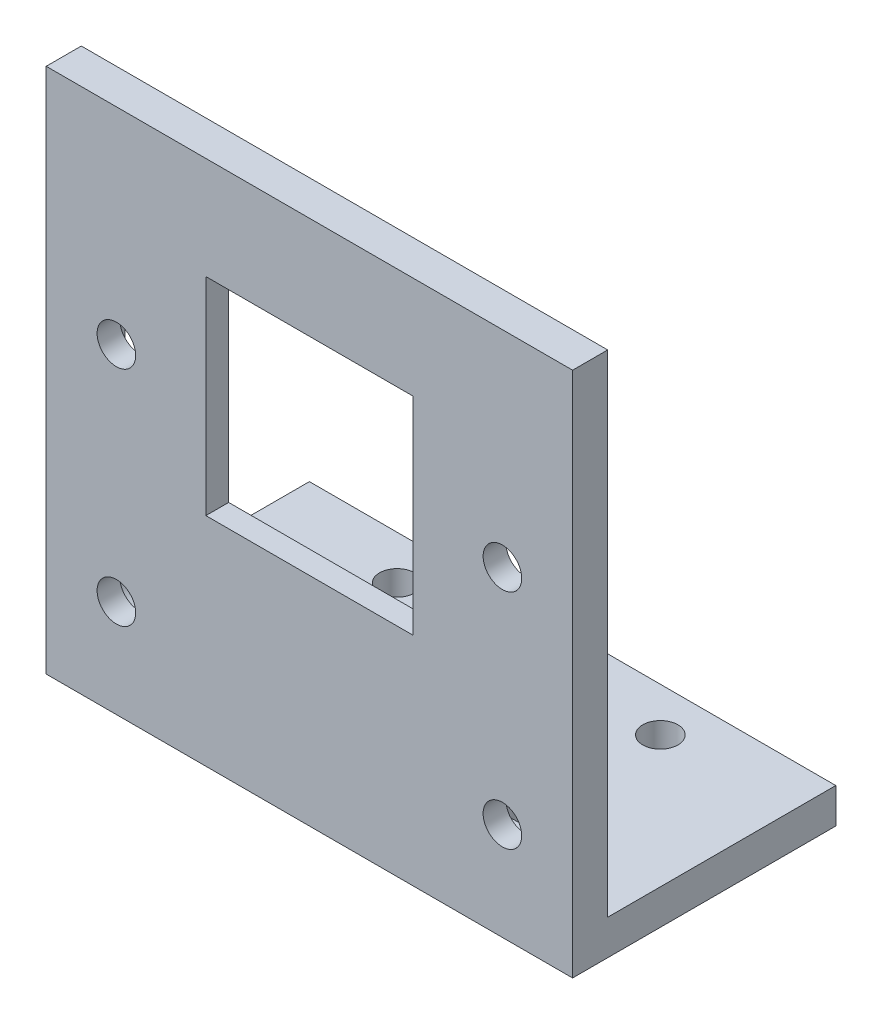
ISO-10303-21;
HEADER;
FILE_DESCRIPTION(('STEP AP214'),'2;1');
FILE_NAME('part.step','',(''),(''),'','','');
FILE_SCHEMA(('AUTOMOTIVE_DESIGN { 1 0 10303 214 1 1 1 1 }'));
ENDSEC;
DATA;
#1=APPLICATION_CONTEXT('core data for automotive mechanical design processes');
#2=APPLICATION_PROTOCOL_DEFINITION('international standard','automotive_design',2000,#1);
#3=PRODUCT_CONTEXT('',#1,'mechanical');
#4=PRODUCT('Part','Part','',(#3));
#5=PRODUCT_RELATED_PRODUCT_CATEGORY('part','',(#4));
#6=PRODUCT_DEFINITION_FORMATION('','',#4);
#7=PRODUCT_DEFINITION_CONTEXT('part definition',#1,'design');
#8=PRODUCT_DEFINITION('design','',#6,#7);
#9=PRODUCT_DEFINITION_SHAPE('','',#8);
#10=(LENGTH_UNIT() NAMED_UNIT(*) SI_UNIT(.MILLI.,.METRE.));
#11=(NAMED_UNIT(*) PLANE_ANGLE_UNIT() SI_UNIT($,.RADIAN.));
#12=(NAMED_UNIT(*) SI_UNIT($,.STERADIAN.) SOLID_ANGLE_UNIT());
#13=UNCERTAINTY_MEASURE_WITH_UNIT(LENGTH_MEASURE(1.E-05),#10,'distance_accuracy_value','');
#14=(GEOMETRIC_REPRESENTATION_CONTEXT(3) GLOBAL_UNCERTAINTY_ASSIGNED_CONTEXT((#13)) GLOBAL_UNIT_ASSIGNED_CONTEXT((#10,
#11,#12)) REPRESENTATION_CONTEXT('',''));
#15=CARTESIAN_POINT('',(0.,0.,0.));
#16=DIRECTION('',(0.,0.,1.));
#17=DIRECTION('',(1.,0.,0.));
#18=AXIS2_PLACEMENT_3D('',#15,#16,#17);
#19=CARTESIAN_POINT('',(11.,56.95,17.2));
#20=DIRECTION('',(0.,0.,-1.));
#21=DIRECTION('',(0.,1.,0.));
#22=AXIS2_PLACEMENT_3D('',#19,#20,#21);
#23=PLANE('',#22);
#24=CARTESIAN_POINT('',(-11.,48.7216,17.2));
#25=DIRECTION('',(0.,0.,-1.));
#26=DIRECTION('',(0.,1.,0.));
#27=AXIS2_PLACEMENT_3D('',#24,#25,#26);
#28=CIRCLE('',#27,1.09999999999999);
#29=CARTESIAN_POINT('',(-11.,49.8216,17.2));
#30=VERTEX_POINT('',#29);
#31=EDGE_CURVE('E606',#30,#30,#28,.F.);
#32=ORIENTED_EDGE('',*,*,#31,.T.);
#33=EDGE_LOOP('',(#32));
#34=FACE_BOUND('',#33,.T.);
#35=CARTESIAN_POINT('',(-11.,36.0216,17.2));
#36=DIRECTION('',(0.,0.,-1.));
#37=DIRECTION('',(0.,1.,0.));
#38=AXIS2_PLACEMENT_3D('',#35,#36,#37);
#39=CIRCLE('',#38,1.09999999999999);
#40=CARTESIAN_POINT('',(-11.,37.1216,17.2));
#41=VERTEX_POINT('',#40);
#42=EDGE_CURVE('E610',#41,#41,#39,.F.);
#43=ORIENTED_EDGE('',*,*,#42,.T.);
#44=EDGE_LOOP('',(#43));
#45=FACE_BOUND('',#44,.T.);
#46=CARTESIAN_POINT('',(11.,36.0216,17.2));
#47=DIRECTION('',(0.,0.,-1.));
#48=DIRECTION('',(0.,1.,0.));
#49=AXIS2_PLACEMENT_3D('',#46,#47,#48);
#50=CIRCLE('',#49,1.09999999999999);
#51=CARTESIAN_POINT('',(11.,37.1216,17.2));
#52=VERTEX_POINT('',#51);
#53=EDGE_CURVE('E631',#52,#52,#50,.F.);
#54=ORIENTED_EDGE('',*,*,#53,.T.);
#55=EDGE_LOOP('',(#54));
#56=FACE_BOUND('',#55,.T.);
#57=CARTESIAN_POINT('',(11.,48.7216,17.2));
#58=DIRECTION('',(0.,0.,-1.));
#59=DIRECTION('',(0.,1.,0.));
#60=AXIS2_PLACEMENT_3D('',#57,#58,#59);
#61=CIRCLE('',#60,1.09999999999999);
#62=CARTESIAN_POINT('',(11.,49.8216,17.2));
#63=VERTEX_POINT('',#62);
#64=EDGE_CURVE('E621',#63,#63,#61,.F.);
#65=ORIENTED_EDGE('',*,*,#64,.T.);
#66=EDGE_LOOP('',(#65));
#67=FACE_BOUND('',#66,.T.);
#68=CARTESIAN_POINT('',(11.,56.95,17.2));
#69=DIRECTION('',(0.,0.,-1.));
#70=DIRECTION('',(0.,1.,0.));
#71=AXIS2_PLACEMENT_3D('',#68,#69,#70);
#72=CIRCLE('',#71,1.5);
#73=CARTESIAN_POINT('',(11.,58.45,17.2));
#74=VERTEX_POINT('',#73);
#75=CARTESIAN_POINT('',(12.5,56.95,17.2));
#76=VERTEX_POINT('',#75);
#77=EDGE_CURVE('E193',#74,#76,#72,.T.);
#78=ORIENTED_EDGE('',*,*,#77,.T.);
#79=DIRECTION('',(0.,-1.,0.));
#80=VECTOR('',#79,1.);
#81=CARTESIAN_POINT('',(12.5,56.95,17.2));
#82=LINE('',#81,#80);
#83=CARTESIAN_POINT('',(12.5,36.09,17.2));
#84=VERTEX_POINT('',#83);
#85=EDGE_CURVE('E196',#76,#84,#82,.T.);
#86=ORIENTED_EDGE('',*,*,#85,.T.);
#87=CARTESIAN_POINT('',(11.,36.09,17.2));
#88=DIRECTION('',(0.,0.,-1.));
#89=DIRECTION('',(0.,1.,0.));
#90=AXIS2_PLACEMENT_3D('',#87,#88,#89);
#91=CIRCLE('',#90,1.5);
#92=CARTESIAN_POINT('',(11.,34.59,17.2));
#93=VERTEX_POINT('',#92);
#94=EDGE_CURVE('E199',#84,#93,#91,.T.);
#95=ORIENTED_EDGE('',*,*,#94,.T.);
#96=DIRECTION('',(-1.,0.,0.));
#97=VECTOR('',#96,1.);
#98=CARTESIAN_POINT('',(-11.,34.59,17.2));
#99=LINE('',#98,#97);
#100=CARTESIAN_POINT('',(-11.,34.59,17.2));
#101=VERTEX_POINT('',#100);
#102=EDGE_CURVE('E202',#93,#101,#99,.T.);
#103=ORIENTED_EDGE('',*,*,#102,.T.);
#104=CARTESIAN_POINT('',(-11.,36.09,17.2));
#105=DIRECTION('',(0.,0.,-1.));
#106=DIRECTION('',(0.,1.,0.));
#107=AXIS2_PLACEMENT_3D('',#104,#105,#106);
#108=CIRCLE('',#107,1.5);
#109=CARTESIAN_POINT('',(-12.5,36.09,17.2));
#110=VERTEX_POINT('',#109);
#111=EDGE_CURVE('E205',#101,#110,#108,.T.);
#112=ORIENTED_EDGE('',*,*,#111,.T.);
#113=DIRECTION('',(0.,1.,0.));
#114=VECTOR('',#113,1.);
#115=CARTESIAN_POINT('',(-12.5,36.09,17.2));
#116=LINE('',#115,#114);
#117=CARTESIAN_POINT('',(-12.5,56.95,17.2));
#118=VERTEX_POINT('',#117);
#119=EDGE_CURVE('E208',#110,#118,#116,.T.);
#120=ORIENTED_EDGE('',*,*,#119,.T.);
#121=CARTESIAN_POINT('',(-11.,56.95,17.2));
#122=DIRECTION('',(0.,0.,-1.));
#123=DIRECTION('',(0.,1.,0.));
#124=AXIS2_PLACEMENT_3D('',#121,#122,#123);
#125=CIRCLE('',#124,1.5);
#126=CARTESIAN_POINT('',(-11.,58.45,17.2));
#127=VERTEX_POINT('',#126);
#128=EDGE_CURVE('E210',#118,#127,#125,.T.);
#129=ORIENTED_EDGE('',*,*,#128,.T.);
#130=DIRECTION('',(1.,0.,0.));
#131=VECTOR('',#130,1.);
#132=CARTESIAN_POINT('',(-11.,58.45,17.2));
#133=LINE('',#132,#131);
#134=EDGE_CURVE('E213',#127,#74,#133,.T.);
#135=ORIENTED_EDGE('',*,*,#134,.T.);
#136=EDGE_LOOP('',(#78,#86,#95,#103,#112,#120,#129,#135));
#137=FACE_BOUND('',#136,.T.);
#138=DIRECTION('',(0.,1.,0.));
#139=VECTOR('',#138,1.);
#140=CARTESIAN_POINT('',(5.9,42.8216,17.2));
#141=LINE('',#140,#139);
#142=CARTESIAN_POINT('',(5.9,42.8216,17.2));
#143=VERTEX_POINT('',#142);
#144=CARTESIAN_POINT('',(5.9,54.6216,17.2));
#145=VERTEX_POINT('',#144);
#146=EDGE_CURVE('E175',#143,#145,#141,.T.);
#147=ORIENTED_EDGE('',*,*,#146,.T.);
#148=DIRECTION('',(-1.,0.,0.));
#149=VECTOR('',#148,1.);
#150=CARTESIAN_POINT('',(5.9,54.6216,17.2));
#151=LINE('',#150,#149);
#152=CARTESIAN_POINT('',(-5.90000000000001,54.6216,17.2));
#153=VERTEX_POINT('',#152);
#154=EDGE_CURVE('E170',#145,#153,#151,.T.);
#155=ORIENTED_EDGE('',*,*,#154,.T.);
#156=DIRECTION('',(0.,-1.,0.));
#157=VECTOR('',#156,1.);
#158=CARTESIAN_POINT('',(-5.90000000000001,54.6216,17.2));
#159=LINE('',#158,#157);
#160=CARTESIAN_POINT('',(-5.90000000000001,42.8216,17.2));
#161=VERTEX_POINT('',#160);
#162=EDGE_CURVE('E159',#153,#161,#159,.T.);
#163=ORIENTED_EDGE('',*,*,#162,.T.);
#164=DIRECTION('',(1.,0.,0.));
#165=VECTOR('',#164,1.);
#166=CARTESIAN_POINT('',(-5.90000000000001,42.8216,17.2));
#167=LINE('',#166,#165);
#168=EDGE_CURVE('E179',#161,#143,#167,.T.);
#169=ORIENTED_EDGE('',*,*,#168,.T.);
#170=EDGE_LOOP('',(#147,#155,#163,#169));
#171=FACE_BOUND('',#170,.T.);
#172=ADVANCED_FACE('F33',(#34,#45,#56,#67,#137,#171),#23,.T.);
#173=CARTESIAN_POINT('',(15.,32.45,3.5));
#174=DIRECTION('',(0.,0.,1.));
#175=DIRECTION('',(1.,0.,0.));
#176=AXIS2_PLACEMENT_3D('',#173,#174,#175);
#177=PLANE('',#176);
#178=DIRECTION('',(0.,1.,0.));
#179=VECTOR('',#178,1.);
#180=CARTESIAN_POINT('',(-15.,32.45,3.5));
#181=LINE('',#180,#179);
#182=CARTESIAN_POINT('',(-15.,30.45,3.5));
#183=VERTEX_POINT('',#182);
#184=CARTESIAN_POINT('',(-15.,32.45,3.5));
#185=VERTEX_POINT('',#184);
#186=EDGE_CURVE('E282',#183,#185,#181,.T.);
#187=ORIENTED_EDGE('',*,*,#186,.T.);
#188=DIRECTION('',(-1.,0.,0.));
#189=VECTOR('',#188,1.);
#190=CARTESIAN_POINT('',(15.,32.45,3.5));
#191=LINE('',#190,#189);
#192=CARTESIAN_POINT('',(15.,32.45,3.5));
#193=VERTEX_POINT('',#192);
#194=EDGE_CURVE('E11',#193,#185,#191,.T.);
#195=ORIENTED_EDGE('',*,*,#194,.F.);
#196=DIRECTION('',(0.,1.,0.));
#197=VECTOR('',#196,1.);
#198=CARTESIAN_POINT('',(15.,32.45,3.5));
#199=LINE('',#198,#197);
#200=CARTESIAN_POINT('',(15.,30.45,3.5));
#201=VERTEX_POINT('',#200);
#202=EDGE_CURVE('E267',#201,#193,#199,.T.);
#203=ORIENTED_EDGE('',*,*,#202,.F.);
#204=DIRECTION('',(-1.,0.,0.));
#205=VECTOR('',#204,1.);
#206=CARTESIAN_POINT('',(15.,30.45,3.5));
#207=LINE('',#206,#205);
#208=EDGE_CURVE('E281',#201,#183,#207,.T.);
#209=ORIENTED_EDGE('',*,*,#208,.T.);
#210=EDGE_LOOP('',(#187,#195,#203,#209));
#211=FACE_BOUND('',#210,.T.);
#212=ADVANCED_FACE('F35',(#211),#177,.F.);
#213=CARTESIAN_POINT('',(15.,32.45,16.5));
#214=DIRECTION('',(0.,-1.,0.));
#215=DIRECTION('',(0.,0.,-1.));
#216=AXIS2_PLACEMENT_3D('',#213,#214,#215);
#217=PLANE('',#216);
#218=CARTESIAN_POINT('',(-7.5,32.45,6.));
#219=DIRECTION('',(0.,1.,0.));
#220=DIRECTION('',(0.,0.,1.));
#221=AXIS2_PLACEMENT_3D('',#218,#219,#220);
#222=CIRCLE('',#221,1.);
#223=CARTESIAN_POINT('',(-7.5,32.45,7.));
#224=VERTEX_POINT('',#223);
#225=EDGE_CURVE('E255',#224,#224,#222,.T.);
#226=ORIENTED_EDGE('',*,*,#225,.F.);
#227=EDGE_LOOP('',(#226));
#228=FACE_BOUND('',#227,.T.);
#229=CARTESIAN_POINT('',(7.5,32.45,6.));
#230=DIRECTION('',(0.,1.,0.));
#231=DIRECTION('',(0.,0.,1.));
#232=AXIS2_PLACEMENT_3D('',#229,#230,#231);
#233=CIRCLE('',#232,1.);
#234=CARTESIAN_POINT('',(7.5,32.45,7.));
#235=VERTEX_POINT('',#234);
#236=EDGE_CURVE('E259',#235,#235,#233,.T.);
#237=ORIENTED_EDGE('',*,*,#236,.F.);
#238=EDGE_LOOP('',(#237));
#239=FACE_BOUND('',#238,.T.);
#240=CARTESIAN_POINT('',(7.5,32.45,14.));
#241=DIRECTION('',(0.,1.,0.));
#242=DIRECTION('',(0.,0.,1.));
#243=AXIS2_PLACEMENT_3D('',#240,#241,#242);
#244=CIRCLE('',#243,1.);
#245=CARTESIAN_POINT('',(7.5,32.45,15.));
#246=VERTEX_POINT('',#245);
#247=EDGE_CURVE('E262',#246,#246,#244,.T.);
#248=ORIENTED_EDGE('',*,*,#247,.F.);
#249=EDGE_LOOP('',(#248));
#250=FACE_BOUND('',#249,.T.);
#251=CARTESIAN_POINT('',(-7.5,32.45,14.));
#252=DIRECTION('',(0.,1.,0.));
#253=DIRECTION('',(0.,0.,1.));
#254=AXIS2_PLACEMENT_3D('',#251,#252,#253);
#255=CIRCLE('',#254,1.);
#256=CARTESIAN_POINT('',(-7.5,32.45,15.));
#257=VERTEX_POINT('',#256);
#258=EDGE_CURVE('E240',#257,#257,#255,.T.);
#259=ORIENTED_EDGE('',*,*,#258,.F.);
#260=EDGE_LOOP('',(#259));
#261=FACE_BOUND('',#260,.T.);
#262=DIRECTION('',(0.,0.,1.));
#263=VECTOR('',#262,1.);
#264=CARTESIAN_POINT('',(-15.,32.45,16.5));
#265=LINE('',#264,#263);
#266=CARTESIAN_POINT('',(-15.,32.45,16.5));
#267=VERTEX_POINT('',#266);
#268=EDGE_CURVE('E285',#185,#267,#265,.T.);
#269=ORIENTED_EDGE('',*,*,#268,.T.);
#270=DIRECTION('',(-1.,0.,0.));
#271=VECTOR('',#270,1.);
#272=CARTESIAN_POINT('',(15.,32.45,16.5));
#273=LINE('',#272,#271);
#274=CARTESIAN_POINT('',(15.,32.45,16.5));
#275=VERTEX_POINT('',#274);
#276=EDGE_CURVE('E42',#275,#267,#273,.T.);
#277=ORIENTED_EDGE('',*,*,#276,.F.);
#278=DIRECTION('',(0.,0.,1.));
#279=VECTOR('',#278,1.);
#280=CARTESIAN_POINT('',(15.,32.45,16.5));
#281=LINE('',#280,#279);
#282=EDGE_CURVE('E270',#193,#275,#281,.T.);
#283=ORIENTED_EDGE('',*,*,#282,.F.);
#284=ORIENTED_EDGE('',*,*,#194,.T.);
#285=EDGE_LOOP('',(#269,#277,#283,#284));
#286=FACE_BOUND('',#285,.T.);
#287=ADVANCED_FACE('F342',(#228,#239,#250,#261,#286),#217,.F.);
#288=CARTESIAN_POINT('',(15.,60.45,16.5));
#289=DIRECTION('',(0.,0.,1.));
#290=DIRECTION('',(0.,-1.,0.));
#291=AXIS2_PLACEMENT_3D('',#288,#289,#290);
#292=PLANE('',#291);
#293=DIRECTION('',(0.,-1.,0.));
#294=VECTOR('',#293,1.);
#295=CARTESIAN_POINT('',(12.5,36.09,16.5));
#296=LINE('',#295,#294);
#297=CARTESIAN_POINT('',(12.5,56.95,16.5));
#298=VERTEX_POINT('',#297);
#299=CARTESIAN_POINT('',(12.5,36.09,16.5));
#300=VERTEX_POINT('',#299);
#301=EDGE_CURVE('E218',#298,#300,#296,.T.);
#302=ORIENTED_EDGE('',*,*,#301,.F.);
#303=CARTESIAN_POINT('',(11.,56.95,16.5));
#304=DIRECTION('',(0.,0.,-1.));
#305=DIRECTION('',(0.,1.,0.));
#306=AXIS2_PLACEMENT_3D('',#303,#304,#305);
#307=CIRCLE('',#306,1.5);
#308=CARTESIAN_POINT('',(11.,58.45,16.5));
#309=VERTEX_POINT('',#308);
#310=EDGE_CURVE('E166',#309,#298,#307,.T.);
#311=ORIENTED_EDGE('',*,*,#310,.F.);
#312=DIRECTION('',(1.,0.,0.));
#313=VECTOR('',#312,1.);
#314=CARTESIAN_POINT('',(-11.,58.45,16.5));
#315=LINE('',#314,#313);
#316=CARTESIAN_POINT('',(-11.,58.45,16.5));
#317=VERTEX_POINT('',#316);
#318=EDGE_CURVE('E197',#317,#309,#315,.T.);
#319=ORIENTED_EDGE('',*,*,#318,.F.);
#320=CARTESIAN_POINT('',(-11.,56.95,16.5));
#321=DIRECTION('',(0.,0.,-1.));
#322=DIRECTION('',(0.,1.,0.));
#323=AXIS2_PLACEMENT_3D('',#320,#321,#322);
#324=CIRCLE('',#323,1.5);
#325=CARTESIAN_POINT('',(-12.5,56.95,16.5));
#326=VERTEX_POINT('',#325);
#327=EDGE_CURVE('E233',#326,#317,#324,.T.);
#328=ORIENTED_EDGE('',*,*,#327,.F.);
#329=DIRECTION('',(0.,1.,0.));
#330=VECTOR('',#329,1.);
#331=CARTESIAN_POINT('',(-12.5,52.74,16.5));
#332=LINE('',#331,#330);
#333=CARTESIAN_POINT('',(-12.5,36.09,16.5));
#334=VERTEX_POINT('',#333);
#335=EDGE_CURVE('E230',#334,#326,#332,.T.);
#336=ORIENTED_EDGE('',*,*,#335,.F.);
#337=CARTESIAN_POINT('',(-11.,36.09,16.5));
#338=DIRECTION('',(0.,0.,-1.));
#339=DIRECTION('',(0.,1.,0.));
#340=AXIS2_PLACEMENT_3D('',#337,#338,#339);
#341=CIRCLE('',#340,1.5);
#342=CARTESIAN_POINT('',(-11.,34.59,16.5));
#343=VERTEX_POINT('',#342);
#344=EDGE_CURVE('E227',#343,#334,#341,.T.);
#345=ORIENTED_EDGE('',*,*,#344,.F.);
#346=DIRECTION('',(-1.,0.,0.));
#347=VECTOR('',#346,1.);
#348=CARTESIAN_POINT('',(-11.,34.59,16.5));
#349=LINE('',#348,#347);
#350=CARTESIAN_POINT('',(11.,34.59,16.5));
#351=VERTEX_POINT('',#350);
#352=EDGE_CURVE('E224',#351,#343,#349,.T.);
#353=ORIENTED_EDGE('',*,*,#352,.F.);
#354=CARTESIAN_POINT('',(11.,36.09,16.5));
#355=DIRECTION('',(0.,0.,-1.));
#356=DIRECTION('',(0.,1.,0.));
#357=AXIS2_PLACEMENT_3D('',#354,#355,#356);
#358=CIRCLE('',#357,1.5);
#359=EDGE_CURVE('E221',#300,#351,#358,.T.);
#360=ORIENTED_EDGE('',*,*,#359,.F.);
#361=EDGE_LOOP('',(#302,#311,#319,#328,#336,#345,#353,#360));
#362=FACE_BOUND('',#361,.T.);
#363=DIRECTION('',(0.,1.,0.));
#364=VECTOR('',#363,1.);
#365=CARTESIAN_POINT('',(-15.,60.45,16.5));
#366=LINE('',#365,#364);
#367=CARTESIAN_POINT('',(-15.,60.45,16.5));
#368=VERTEX_POINT('',#367);
#369=EDGE_CURVE('E287',#267,#368,#366,.T.);
#370=ORIENTED_EDGE('',*,*,#369,.T.);
#371=DIRECTION('',(-1.,0.,0.));
#372=VECTOR('',#371,1.);
#373=CARTESIAN_POINT('',(15.,60.45,16.5));
#374=LINE('',#373,#372);
#375=CARTESIAN_POINT('',(15.,60.45,16.5));
#376=VERTEX_POINT('',#375);
#377=EDGE_CURVE('E302',#376,#368,#374,.T.);
#378=ORIENTED_EDGE('',*,*,#377,.F.);
#379=DIRECTION('',(0.,1.,0.));
#380=VECTOR('',#379,1.);
#381=CARTESIAN_POINT('',(15.,60.45,16.5));
#382=LINE('',#381,#380);
#383=EDGE_CURVE('E273',#275,#376,#382,.T.);
#384=ORIENTED_EDGE('',*,*,#383,.F.);
#385=ORIENTED_EDGE('',*,*,#276,.T.);
#386=EDGE_LOOP('',(#370,#378,#384,#385));
#387=FACE_BOUND('',#386,.T.);
#388=ADVANCED_FACE('F387',(#362,#387),#292,.F.);
#389=CARTESIAN_POINT('',(15.,60.45,18.5));
#390=DIRECTION('',(0.,-1.,0.));
#391=DIRECTION('',(0.,0.,-1.));
#392=AXIS2_PLACEMENT_3D('',#389,#390,#391);
#393=PLANE('',#392);
#394=DIRECTION('',(0.,0.,1.));
#395=VECTOR('',#394,1.);
#396=CARTESIAN_POINT('',(-15.,60.45,18.5));
#397=LINE('',#396,#395);
#398=CARTESIAN_POINT('',(-15.,60.45,18.5));
#399=VERTEX_POINT('',#398);
#400=EDGE_CURVE('E289',#368,#399,#397,.T.);
#401=ORIENTED_EDGE('',*,*,#400,.T.);
#402=DIRECTION('',(-1.,0.,0.));
#403=VECTOR('',#402,1.);
#404=CARTESIAN_POINT('',(15.,60.45,18.5));
#405=LINE('',#404,#403);
#406=CARTESIAN_POINT('',(15.,60.45,18.5));
#407=VERTEX_POINT('',#406);
#408=EDGE_CURVE('E299',#407,#399,#405,.T.);
#409=ORIENTED_EDGE('',*,*,#408,.F.);
#410=DIRECTION('',(0.,0.,1.));
#411=VECTOR('',#410,1.);
#412=CARTESIAN_POINT('',(15.,60.45,18.5));
#413=LINE('',#412,#411);
#414=EDGE_CURVE('E275',#376,#407,#413,.T.);
#415=ORIENTED_EDGE('',*,*,#414,.F.);
#416=ORIENTED_EDGE('',*,*,#377,.T.);
#417=EDGE_LOOP('',(#401,#409,#415,#416));
#418=FACE_BOUND('',#417,.T.);
#419=ADVANCED_FACE('F402',(#418),#393,.F.);
#420=CARTESIAN_POINT('',(15.,30.45,18.5));
#421=DIRECTION('',(0.,0.,-1.));
#422=DIRECTION('',(-1.,0.,0.));
#423=AXIS2_PLACEMENT_3D('',#420,#421,#422);
#424=PLANE('',#423);
#425=CARTESIAN_POINT('',(-11.,48.7216,18.5));
#426=DIRECTION('',(0.,0.,1.));
#427=DIRECTION('',(1.,0.,0.));
#428=AXIS2_PLACEMENT_3D('',#425,#426,#427);
#429=CIRCLE('',#428,1.09999999999999);
#430=CARTESIAN_POINT('',(-9.90000000000001,48.7216,18.5));
#431=VERTEX_POINT('',#430);
#432=EDGE_CURVE('E609',#431,#431,#429,.T.);
#433=ORIENTED_EDGE('',*,*,#432,.F.);
#434=EDGE_LOOP('',(#433));
#435=FACE_BOUND('',#434,.T.);
#436=CARTESIAN_POINT('',(-11.,36.0216,18.5));
#437=DIRECTION('',(0.,0.,1.));
#438=DIRECTION('',(1.,0.,0.));
#439=AXIS2_PLACEMENT_3D('',#436,#437,#438);
#440=CIRCLE('',#439,1.09999999999999);
#441=CARTESIAN_POINT('',(-9.90000000000001,36.0216,18.5));
#442=VERTEX_POINT('',#441);
#443=EDGE_CURVE('E613',#442,#442,#440,.T.);
#444=ORIENTED_EDGE('',*,*,#443,.F.);
#445=EDGE_LOOP('',(#444));
#446=FACE_BOUND('',#445,.T.);
#447=CARTESIAN_POINT('',(11.,36.0216,18.5));
#448=DIRECTION('',(0.,0.,1.));
#449=DIRECTION('',(1.,0.,0.));
#450=AXIS2_PLACEMENT_3D('',#447,#448,#449);
#451=CIRCLE('',#450,1.09999999999999);
#452=CARTESIAN_POINT('',(12.1,36.0216,18.5));
#453=VERTEX_POINT('',#452);
#454=EDGE_CURVE('E623',#453,#453,#451,.T.);
#455=ORIENTED_EDGE('',*,*,#454,.F.);
#456=EDGE_LOOP('',(#455));
#457=FACE_BOUND('',#456,.T.);
#458=CARTESIAN_POINT('',(11.,48.7216,18.5));
#459=DIRECTION('',(0.,0.,1.));
#460=DIRECTION('',(1.,0.,0.));
#461=AXIS2_PLACEMENT_3D('',#458,#459,#460);
#462=CIRCLE('',#461,1.09999999999999);
#463=CARTESIAN_POINT('',(12.1,48.7216,18.5));
#464=VERTEX_POINT('',#463);
#465=EDGE_CURVE('E618',#464,#464,#462,.T.);
#466=ORIENTED_EDGE('',*,*,#465,.F.);
#467=EDGE_LOOP('',(#466));
#468=FACE_BOUND('',#467,.T.);
#469=DIRECTION('',(0.,-1.,0.));
#470=VECTOR('',#469,1.);
#471=CARTESIAN_POINT('',(-5.90000000000001,54.6216,18.5));
#472=LINE('',#471,#470);
#473=CARTESIAN_POINT('',(-5.90000000000001,54.6216,18.5));
#474=VERTEX_POINT('',#473);
#475=CARTESIAN_POINT('',(-5.90000000000001,42.8216,18.5));
#476=VERTEX_POINT('',#475);
#477=EDGE_CURVE('E177',#474,#476,#472,.T.);
#478=ORIENTED_EDGE('',*,*,#477,.F.);
#479=DIRECTION('',(-1.,0.,0.));
#480=VECTOR('',#479,1.);
#481=CARTESIAN_POINT('',(5.9,54.6216,18.5));
#482=LINE('',#481,#480);
#483=CARTESIAN_POINT('',(5.9,54.6216,18.5));
#484=VERTEX_POINT('',#483);
#485=EDGE_CURVE('E58',#484,#474,#482,.T.);
#486=ORIENTED_EDGE('',*,*,#485,.F.);
#487=DIRECTION('',(0.,1.,0.));
#488=VECTOR('',#487,1.);
#489=CARTESIAN_POINT('',(5.9,42.8216,18.5));
#490=LINE('',#489,#488);
#491=CARTESIAN_POINT('',(5.9,42.8216,18.5));
#492=VERTEX_POINT('',#491);
#493=EDGE_CURVE('E172',#492,#484,#490,.T.);
#494=ORIENTED_EDGE('',*,*,#493,.F.);
#495=DIRECTION('',(1.,0.,0.));
#496=VECTOR('',#495,1.);
#497=CARTESIAN_POINT('',(-5.90000000000001,42.8216,18.5));
#498=LINE('',#497,#496);
#499=EDGE_CURVE('E184',#476,#492,#498,.T.);
#500=ORIENTED_EDGE('',*,*,#499,.F.);
#501=EDGE_LOOP('',(#478,#486,#494,#500));
#502=FACE_BOUND('',#501,.T.);
#503=DIRECTION('',(0.,-1.,0.));
#504=VECTOR('',#503,1.);
#505=CARTESIAN_POINT('',(-15.,30.45,18.5));
#506=LINE('',#505,#504);
#507=CARTESIAN_POINT('',(-15.,30.45,18.5));
#508=VERTEX_POINT('',#507);
#509=EDGE_CURVE('E291',#399,#508,#506,.T.);
#510=ORIENTED_EDGE('',*,*,#509,.T.);
#511=DIRECTION('',(-1.,0.,0.));
#512=VECTOR('',#511,1.);
#513=CARTESIAN_POINT('',(15.,30.45,18.5));
#514=LINE('',#513,#512);
#515=CARTESIAN_POINT('',(15.,30.45,18.5));
#516=VERTEX_POINT('',#515);
#517=EDGE_CURVE('E296',#516,#508,#514,.T.);
#518=ORIENTED_EDGE('',*,*,#517,.F.);
#519=DIRECTION('',(0.,-1.,0.));
#520=VECTOR('',#519,1.);
#521=CARTESIAN_POINT('',(15.,30.45,18.5));
#522=LINE('',#521,#520);
#523=EDGE_CURVE('E277',#407,#516,#522,.T.);
#524=ORIENTED_EDGE('',*,*,#523,.F.);
#525=ORIENTED_EDGE('',*,*,#408,.T.);
#526=EDGE_LOOP('',(#510,#518,#524,#525));
#527=FACE_BOUND('',#526,.T.);
#528=ADVANCED_FACE('F419',(#435,#446,#457,#468,#502,#527),#424,.F.);
#529=CARTESIAN_POINT('',(15.,30.45,3.5));
#530=DIRECTION('',(0.,1.,0.));
#531=DIRECTION('',(0.,0.,1.));
#532=AXIS2_PLACEMENT_3D('',#529,#530,#531);
#533=PLANE('',#532);
#534=CARTESIAN_POINT('',(-7.5,30.45,6.));
#535=DIRECTION('',(0.,1.,0.));
#536=DIRECTION('',(0.,0.,1.));
#537=AXIS2_PLACEMENT_3D('',#534,#535,#536);
#538=CIRCLE('',#537,1.);
#539=CARTESIAN_POINT('',(-7.5,30.45,7.));
#540=VERTEX_POINT('',#539);
#541=EDGE_CURVE('E37',#540,#540,#538,.T.);
#542=ORIENTED_EDGE('',*,*,#541,.T.);
#543=EDGE_LOOP('',(#542));
#544=FACE_BOUND('',#543,.T.);
#545=CARTESIAN_POINT('',(7.5,30.45,6.));
#546=DIRECTION('',(0.,1.,0.));
#547=DIRECTION('',(0.,0.,1.));
#548=AXIS2_PLACEMENT_3D('',#545,#546,#547);
#549=CIRCLE('',#548,1.);
#550=CARTESIAN_POINT('',(7.5,30.45,7.));
#551=VERTEX_POINT('',#550);
#552=EDGE_CURVE('E311',#551,#551,#549,.T.);
#553=ORIENTED_EDGE('',*,*,#552,.T.);
#554=EDGE_LOOP('',(#553));
#555=FACE_BOUND('',#554,.T.);
#556=CARTESIAN_POINT('',(7.5,30.45,14.));
#557=DIRECTION('',(0.,1.,0.));
#558=DIRECTION('',(0.,0.,1.));
#559=AXIS2_PLACEMENT_3D('',#556,#557,#558);
#560=CIRCLE('',#559,1.);
#561=CARTESIAN_POINT('',(7.5,30.45,15.));
#562=VERTEX_POINT('',#561);
#563=EDGE_CURVE('E309',#562,#562,#560,.T.);
#564=ORIENTED_EDGE('',*,*,#563,.T.);
#565=EDGE_LOOP('',(#564));
#566=FACE_BOUND('',#565,.T.);
#567=CARTESIAN_POINT('',(-7.5,30.45,14.));
#568=DIRECTION('',(0.,1.,0.));
#569=DIRECTION('',(0.,0.,1.));
#570=AXIS2_PLACEMENT_3D('',#567,#568,#569);
#571=CIRCLE('',#570,1.);
#572=CARTESIAN_POINT('',(-7.5,30.45,15.));
#573=VERTEX_POINT('',#572);
#574=EDGE_CURVE('E258',#573,#573,#571,.T.);
#575=ORIENTED_EDGE('',*,*,#574,.T.);
#576=EDGE_LOOP('',(#575));
#577=FACE_BOUND('',#576,.T.);
#578=DIRECTION('',(0.,0.,-1.));
#579=VECTOR('',#578,1.);
#580=CARTESIAN_POINT('',(-15.,30.45,3.5));
#581=LINE('',#580,#579);
#582=EDGE_CURVE('E271',#508,#183,#581,.T.);
#583=ORIENTED_EDGE('',*,*,#582,.T.);
#584=ORIENTED_EDGE('',*,*,#208,.F.);
#585=DIRECTION('',(0.,0.,-1.));
#586=VECTOR('',#585,1.);
#587=CARTESIAN_POINT('',(15.,30.45,3.5));
#588=LINE('',#587,#586);
#589=EDGE_CURVE('E279',#516,#201,#588,.T.);
#590=ORIENTED_EDGE('',*,*,#589,.F.);
#591=ORIENTED_EDGE('',*,*,#517,.T.);
#592=EDGE_LOOP('',(#583,#584,#590,#591));
#593=FACE_BOUND('',#592,.T.);
#594=ADVANCED_FACE('F318',(#544,#555,#566,#577,#593),#533,.F.);
#595=CARTESIAN_POINT('',(15.,0.,0.));
#596=DIRECTION('',(-1.,0.,0.));
#597=DIRECTION('',(0.,0.,1.));
#598=AXIS2_PLACEMENT_3D('',#595,#596,#597);
#599=PLANE('',#598);
#600=ORIENTED_EDGE('',*,*,#202,.T.);
#601=ORIENTED_EDGE('',*,*,#282,.T.);
#602=ORIENTED_EDGE('',*,*,#383,.T.);
#603=ORIENTED_EDGE('',*,*,#414,.T.);
#604=ORIENTED_EDGE('',*,*,#523,.T.);
#605=ORIENTED_EDGE('',*,*,#589,.T.);
#606=EDGE_LOOP('',(#600,#601,#602,#603,#604,#605));
#607=FACE_BOUND('',#606,.T.);
#608=ADVANCED_FACE('F426',(#607),#599,.F.);
#609=CARTESIAN_POINT('',(-15.,0.,0.));
#610=DIRECTION('',(-1.,0.,0.));
#611=DIRECTION('',(0.,0.,1.));
#612=AXIS2_PLACEMENT_3D('',#609,#610,#611);
#613=PLANE('',#612);
#614=ORIENTED_EDGE('',*,*,#186,.F.);
#615=ORIENTED_EDGE('',*,*,#582,.F.);
#616=ORIENTED_EDGE('',*,*,#509,.F.);
#617=ORIENTED_EDGE('',*,*,#400,.F.);
#618=ORIENTED_EDGE('',*,*,#369,.F.);
#619=ORIENTED_EDGE('',*,*,#268,.F.);
#620=EDGE_LOOP('',(#614,#615,#616,#617,#618,#619));
#621=FACE_BOUND('',#620,.T.);
#622=ADVANCED_FACE('F415',(#621),#613,.T.);
#623=CARTESIAN_POINT('',(-7.5,25.6215728752538,14.));
#624=DIRECTION('',(0.,1.,0.));
#625=DIRECTION('',(0.,0.,1.));
#626=AXIS2_PLACEMENT_3D('',#623,#624,#625);
#627=CYLINDRICAL_SURFACE('',#626,1.);
#628=ORIENTED_EDGE('',*,*,#258,.T.);
#629=EDGE_LOOP('',(#628));
#630=FACE_BOUND('',#629,.T.);
#631=ORIENTED_EDGE('',*,*,#574,.F.);
#632=EDGE_LOOP('',(#631));
#633=FACE_BOUND('',#632,.T.);
#634=ADVANCED_FACE('F445',(#630,#633),#627,.F.);
#635=CARTESIAN_POINT('',(7.5,25.6215728752538,14.));
#636=DIRECTION('',(0.,1.,0.));
#637=DIRECTION('',(0.,0.,1.));
#638=AXIS2_PLACEMENT_3D('',#635,#636,#637);
#639=CYLINDRICAL_SURFACE('',#638,1.);
#640=ORIENTED_EDGE('',*,*,#247,.T.);
#641=EDGE_LOOP('',(#640));
#642=FACE_BOUND('',#641,.T.);
#643=ORIENTED_EDGE('',*,*,#563,.F.);
#644=EDGE_LOOP('',(#643));
#645=FACE_BOUND('',#644,.T.);
#646=ADVANCED_FACE('F333',(#642,#645),#639,.F.);
#647=CARTESIAN_POINT('',(7.5,25.6215728752538,6.));
#648=DIRECTION('',(0.,1.,0.));
#649=DIRECTION('',(0.,0.,1.));
#650=AXIS2_PLACEMENT_3D('',#647,#648,#649);
#651=CYLINDRICAL_SURFACE('',#650,1.);
#652=ORIENTED_EDGE('',*,*,#236,.T.);
#653=EDGE_LOOP('',(#652));
#654=FACE_BOUND('',#653,.T.);
#655=ORIENTED_EDGE('',*,*,#552,.F.);
#656=EDGE_LOOP('',(#655));
#657=FACE_BOUND('',#656,.T.);
#658=ADVANCED_FACE('F323',(#654,#657),#651,.F.);
#659=CARTESIAN_POINT('',(-7.5,25.6215728752538,6.));
#660=DIRECTION('',(0.,1.,0.));
#661=DIRECTION('',(0.,0.,1.));
#662=AXIS2_PLACEMENT_3D('',#659,#660,#661);
#663=CYLINDRICAL_SURFACE('',#662,1.);
#664=ORIENTED_EDGE('',*,*,#225,.T.);
#665=EDGE_LOOP('',(#664));
#666=FACE_BOUND('',#665,.T.);
#667=ORIENTED_EDGE('',*,*,#541,.F.);
#668=EDGE_LOOP('',(#667));
#669=FACE_BOUND('',#668,.T.);
#670=ADVANCED_FACE('F320',(#666,#669),#663,.F.);
#671=CARTESIAN_POINT('',(11.,56.95,17.2));
#672=DIRECTION('',(0.,0.,-1.));
#673=DIRECTION('',(0.,1.,0.));
#674=AXIS2_PLACEMENT_3D('',#671,#672,#673);
#675=CYLINDRICAL_SURFACE('',#674,1.5);
#676=ORIENTED_EDGE('',*,*,#310,.T.);
#677=DIRECTION('',(0.,0.,-1.));
#678=VECTOR('',#677,1.);
#679=CARTESIAN_POINT('',(12.5,56.95,17.2));
#680=LINE('',#679,#678);
#681=EDGE_CURVE('E216',#76,#298,#680,.T.);
#682=ORIENTED_EDGE('',*,*,#681,.F.);
#683=ORIENTED_EDGE('',*,*,#77,.F.);
#684=DIRECTION('',(0.,0.,-1.));
#685=VECTOR('',#684,1.);
#686=CARTESIAN_POINT('',(11.,58.45,17.2));
#687=LINE('',#686,#685);
#688=EDGE_CURVE('E238',#74,#309,#687,.T.);
#689=ORIENTED_EDGE('',*,*,#688,.T.);
#690=EDGE_LOOP('',(#676,#682,#683,#689));
#691=FACE_BOUND('',#690,.T.);
#692=ADVANCED_FACE('F322',(#691),#675,.F.);
#693=CARTESIAN_POINT('',(-11.,58.45,17.2));
#694=DIRECTION('',(0.,1.,0.));
#695=DIRECTION('',(0.,0.,1.));
#696=AXIS2_PLACEMENT_3D('',#693,#694,#695);
#697=PLANE('',#696);
#698=ORIENTED_EDGE('',*,*,#318,.T.);
#699=ORIENTED_EDGE('',*,*,#688,.F.);
#700=ORIENTED_EDGE('',*,*,#134,.F.);
#701=DIRECTION('',(0.,0.,-1.));
#702=VECTOR('',#701,1.);
#703=CARTESIAN_POINT('',(-11.,58.45,17.2));
#704=LINE('',#703,#702);
#705=EDGE_CURVE('E241',#127,#317,#704,.T.);
#706=ORIENTED_EDGE('',*,*,#705,.T.);
#707=EDGE_LOOP('',(#698,#699,#700,#706));
#708=FACE_BOUND('',#707,.T.);
#709=ADVANCED_FACE('F330',(#708),#697,.F.);
#710=CARTESIAN_POINT('',(-11.,56.95,17.2));
#711=DIRECTION('',(0.,0.,-1.));
#712=DIRECTION('',(0.,1.,0.));
#713=AXIS2_PLACEMENT_3D('',#710,#711,#712);
#714=CYLINDRICAL_SURFACE('',#713,1.5);
#715=ORIENTED_EDGE('',*,*,#327,.T.);
#716=ORIENTED_EDGE('',*,*,#705,.F.);
#717=ORIENTED_EDGE('',*,*,#128,.F.);
#718=DIRECTION('',(0.,0.,-1.));
#719=VECTOR('',#718,1.);
#720=CARTESIAN_POINT('',(-12.5,56.95,17.2));
#721=LINE('',#720,#719);
#722=EDGE_CURVE('E243',#118,#326,#721,.T.);
#723=ORIENTED_EDGE('',*,*,#722,.T.);
#724=EDGE_LOOP('',(#715,#716,#717,#723));
#725=FACE_BOUND('',#724,.T.);
#726=ADVANCED_FACE('F351',(#725),#714,.F.);
#727=CARTESIAN_POINT('',(-12.5,52.74,17.2));
#728=DIRECTION('',(-1.,0.,0.));
#729=DIRECTION('',(0.,0.,1.));
#730=AXIS2_PLACEMENT_3D('',#727,#728,#729);
#731=PLANE('',#730);
#732=ORIENTED_EDGE('',*,*,#335,.T.);
#733=ORIENTED_EDGE('',*,*,#722,.F.);
#734=ORIENTED_EDGE('',*,*,#119,.F.);
#735=DIRECTION('',(0.,0.,-1.));
#736=VECTOR('',#735,1.);
#737=CARTESIAN_POINT('',(-12.5,36.09,17.2));
#738=LINE('',#737,#736);
#739=EDGE_CURVE('E245',#110,#334,#738,.T.);
#740=ORIENTED_EDGE('',*,*,#739,.T.);
#741=EDGE_LOOP('',(#732,#733,#734,#740));
#742=FACE_BOUND('',#741,.T.);
#743=ADVANCED_FACE('F355',(#742),#731,.F.);
#744=CARTESIAN_POINT('',(-11.,36.09,17.2));
#745=DIRECTION('',(0.,0.,-1.));
#746=DIRECTION('',(0.,1.,0.));
#747=AXIS2_PLACEMENT_3D('',#744,#745,#746);
#748=CYLINDRICAL_SURFACE('',#747,1.5);
#749=ORIENTED_EDGE('',*,*,#344,.T.);
#750=ORIENTED_EDGE('',*,*,#739,.F.);
#751=ORIENTED_EDGE('',*,*,#111,.F.);
#752=DIRECTION('',(0.,0.,-1.));
#753=VECTOR('',#752,1.);
#754=CARTESIAN_POINT('',(-11.,34.59,17.2));
#755=LINE('',#754,#753);
#756=EDGE_CURVE('E247',#101,#343,#755,.T.);
#757=ORIENTED_EDGE('',*,*,#756,.T.);
#758=EDGE_LOOP('',(#749,#750,#751,#757));
#759=FACE_BOUND('',#758,.T.);
#760=ADVANCED_FACE('F359',(#759),#748,.F.);
#761=CARTESIAN_POINT('',(-11.,34.59,17.2));
#762=DIRECTION('',(0.,-1.,0.));
#763=DIRECTION('',(0.,0.,-1.));
#764=AXIS2_PLACEMENT_3D('',#761,#762,#763);
#765=PLANE('',#764);
#766=ORIENTED_EDGE('',*,*,#352,.T.);
#767=ORIENTED_EDGE('',*,*,#756,.F.);
#768=ORIENTED_EDGE('',*,*,#102,.F.);
#769=DIRECTION('',(0.,0.,-1.));
#770=VECTOR('',#769,1.);
#771=CARTESIAN_POINT('',(11.,34.59,17.2));
#772=LINE('',#771,#770);
#773=EDGE_CURVE('E249',#93,#351,#772,.T.);
#774=ORIENTED_EDGE('',*,*,#773,.T.);
#775=EDGE_LOOP('',(#766,#767,#768,#774));
#776=FACE_BOUND('',#775,.T.);
#777=ADVANCED_FACE('F363',(#776),#765,.F.);
#778=CARTESIAN_POINT('',(11.,36.09,17.2));
#779=DIRECTION('',(0.,0.,-1.));
#780=DIRECTION('',(0.,1.,0.));
#781=AXIS2_PLACEMENT_3D('',#778,#779,#780);
#782=CYLINDRICAL_SURFACE('',#781,1.5);
#783=ORIENTED_EDGE('',*,*,#359,.T.);
#784=ORIENTED_EDGE('',*,*,#773,.F.);
#785=ORIENTED_EDGE('',*,*,#94,.F.);
#786=DIRECTION('',(0.,0.,-1.));
#787=VECTOR('',#786,1.);
#788=CARTESIAN_POINT('',(12.5,36.09,17.2));
#789=LINE('',#788,#787);
#790=EDGE_CURVE('E251',#84,#300,#789,.T.);
#791=ORIENTED_EDGE('',*,*,#790,.T.);
#792=EDGE_LOOP('',(#783,#784,#785,#791));
#793=FACE_BOUND('',#792,.T.);
#794=ADVANCED_FACE('F367',(#793),#782,.F.);
#795=CARTESIAN_POINT('',(12.5,36.09,17.2));
#796=DIRECTION('',(1.,0.,0.));
#797=DIRECTION('',(0.,0.,-1.));
#798=AXIS2_PLACEMENT_3D('',#795,#796,#797);
#799=PLANE('',#798);
#800=ORIENTED_EDGE('',*,*,#301,.T.);
#801=ORIENTED_EDGE('',*,*,#790,.F.);
#802=ORIENTED_EDGE('',*,*,#85,.F.);
#803=ORIENTED_EDGE('',*,*,#681,.T.);
#804=EDGE_LOOP('',(#800,#801,#802,#803));
#805=FACE_BOUND('',#804,.T.);
#806=ADVANCED_FACE('F371',(#805),#799,.F.);
#807=CARTESIAN_POINT('',(5.9,54.6216,3.499));
#808=DIRECTION('',(0.,1.,0.));
#809=DIRECTION('',(0.,0.,1.));
#810=AXIS2_PLACEMENT_3D('',#807,#808,#809);
#811=PLANE('',#810);
#812=DIRECTION('',(0.,0.,1.));
#813=VECTOR('',#812,1.);
#814=CARTESIAN_POINT('',(5.9,54.6216,3.499));
#815=LINE('',#814,#813);
#816=EDGE_CURVE('E167',#145,#484,#815,.T.);
#817=ORIENTED_EDGE('',*,*,#816,.T.);
#818=ORIENTED_EDGE('',*,*,#485,.T.);
#819=DIRECTION('',(0.,0.,1.));
#820=VECTOR('',#819,1.);
#821=CARTESIAN_POINT('',(-5.90000000000001,54.6216,3.499));
#822=LINE('',#821,#820);
#823=EDGE_CURVE('E161',#153,#474,#822,.T.);
#824=ORIENTED_EDGE('',*,*,#823,.F.);
#825=ORIENTED_EDGE('',*,*,#154,.F.);
#826=EDGE_LOOP('',(#817,#818,#824,#825));
#827=FACE_BOUND('',#826,.T.);
#828=ADVANCED_FACE('F169',(#827),#811,.F.);
#829=CARTESIAN_POINT('',(5.9,42.8216,3.499));
#830=DIRECTION('',(1.,0.,0.));
#831=DIRECTION('',(0.,1.,0.));
#832=AXIS2_PLACEMENT_3D('',#829,#830,#831);
#833=PLANE('',#832);
#834=DIRECTION('',(0.,0.,1.));
#835=VECTOR('',#834,1.);
#836=CARTESIAN_POINT('',(5.9,42.8216,3.499));
#837=LINE('',#836,#835);
#838=EDGE_CURVE('E190',#143,#492,#837,.T.);
#839=ORIENTED_EDGE('',*,*,#838,.T.);
#840=ORIENTED_EDGE('',*,*,#493,.T.);
#841=ORIENTED_EDGE('',*,*,#816,.F.);
#842=ORIENTED_EDGE('',*,*,#146,.F.);
#843=EDGE_LOOP('',(#839,#840,#841,#842));
#844=FACE_BOUND('',#843,.T.);
#845=ADVANCED_FACE('F378',(#844),#833,.F.);
#846=CARTESIAN_POINT('',(-5.90000000000001,42.8216,3.499));
#847=DIRECTION('',(0.,-1.,0.));
#848=DIRECTION('',(0.,0.,-1.));
#849=AXIS2_PLACEMENT_3D('',#846,#847,#848);
#850=PLANE('',#849);
#851=DIRECTION('',(0.,0.,1.));
#852=VECTOR('',#851,1.);
#853=CARTESIAN_POINT('',(-5.90000000000001,42.8216,3.499));
#854=LINE('',#853,#852);
#855=EDGE_CURVE('E50',#161,#476,#854,.T.);
#856=ORIENTED_EDGE('',*,*,#855,.T.);
#857=ORIENTED_EDGE('',*,*,#499,.T.);
#858=ORIENTED_EDGE('',*,*,#838,.F.);
#859=ORIENTED_EDGE('',*,*,#168,.F.);
#860=EDGE_LOOP('',(#856,#857,#858,#859));
#861=FACE_BOUND('',#860,.T.);
#862=ADVANCED_FACE('F544',(#861),#850,.F.);
#863=CARTESIAN_POINT('',(-5.90000000000001,54.6216,3.499));
#864=DIRECTION('',(-1.,0.,0.));
#865=DIRECTION('',(0.,0.,1.));
#866=AXIS2_PLACEMENT_3D('',#863,#864,#865);
#867=PLANE('',#866);
#868=ORIENTED_EDGE('',*,*,#823,.T.);
#869=ORIENTED_EDGE('',*,*,#477,.T.);
#870=ORIENTED_EDGE('',*,*,#855,.F.);
#871=ORIENTED_EDGE('',*,*,#162,.F.);
#872=EDGE_LOOP('',(#868,#869,#870,#871));
#873=FACE_BOUND('',#872,.T.);
#874=ADVANCED_FACE('F160',(#873),#867,.F.);
#875=CARTESIAN_POINT('',(11.,48.7216,3.499));
#876=DIRECTION('',(0.,0.,1.));
#877=DIRECTION('',(1.,0.,0.));
#878=AXIS2_PLACEMENT_3D('',#875,#876,#877);
#879=CYLINDRICAL_SURFACE('',#878,1.09999999999999);
#880=ORIENTED_EDGE('',*,*,#64,.F.);
#881=EDGE_LOOP('',(#880));
#882=FACE_BOUND('',#881,.T.);
#883=ORIENTED_EDGE('',*,*,#465,.T.);
#884=EDGE_LOOP('',(#883));
#885=FACE_BOUND('',#884,.T.);
#886=ADVANCED_FACE('F560',(#882,#885),#879,.F.);
#887=CARTESIAN_POINT('',(11.,36.0216,3.499));
#888=DIRECTION('',(0.,0.,1.));
#889=DIRECTION('',(1.,0.,0.));
#890=AXIS2_PLACEMENT_3D('',#887,#888,#889);
#891=CYLINDRICAL_SURFACE('',#890,1.09999999999999);
#892=ORIENTED_EDGE('',*,*,#53,.F.);
#893=EDGE_LOOP('',(#892));
#894=FACE_BOUND('',#893,.T.);
#895=ORIENTED_EDGE('',*,*,#454,.T.);
#896=EDGE_LOOP('',(#895));
#897=FACE_BOUND('',#896,.T.);
#898=ADVANCED_FACE('F567',(#894,#897),#891,.F.);
#899=CARTESIAN_POINT('',(-11.,36.0216,3.499));
#900=DIRECTION('',(0.,0.,1.));
#901=DIRECTION('',(1.,0.,0.));
#902=AXIS2_PLACEMENT_3D('',#899,#900,#901);
#903=CYLINDRICAL_SURFACE('',#902,1.09999999999999);
#904=ORIENTED_EDGE('',*,*,#42,.F.);
#905=EDGE_LOOP('',(#904));
#906=FACE_BOUND('',#905,.T.);
#907=ORIENTED_EDGE('',*,*,#443,.T.);
#908=EDGE_LOOP('',(#907));
#909=FACE_BOUND('',#908,.T.);
#910=ADVANCED_FACE('F576',(#906,#909),#903,.F.);
#911=CARTESIAN_POINT('',(-11.,48.7216,3.499));
#912=DIRECTION('',(0.,0.,1.));
#913=DIRECTION('',(1.,0.,0.));
#914=AXIS2_PLACEMENT_3D('',#911,#912,#913);
#915=CYLINDRICAL_SURFACE('',#914,1.09999999999999);
#916=ORIENTED_EDGE('',*,*,#31,.F.);
#917=EDGE_LOOP('',(#916));
#918=FACE_BOUND('',#917,.T.);
#919=ORIENTED_EDGE('',*,*,#432,.T.);
#920=EDGE_LOOP('',(#919));
#921=FACE_BOUND('',#920,.T.);
#922=ADVANCED_FACE('F585',(#918,#921),#915,.F.);
#923=CLOSED_SHELL('',(#172,#212,#287,#388,#419,#528,#594,#608,#622,#634,#646,#658,#670,#692,
#709,#726,#743,#760,#777,#794,#806,#828,#845,#862,#874,#886,#898,#910,#922));
#924=MANIFOLD_SOLID_BREP('B2',#923);
#925=ADVANCED_BREP_SHAPE_REPRESENTATION('',(#18,#924),#14);
#926=SHAPE_DEFINITION_REPRESENTATION(#9,#925);
ENDSEC;
END-ISO-10303-21;
